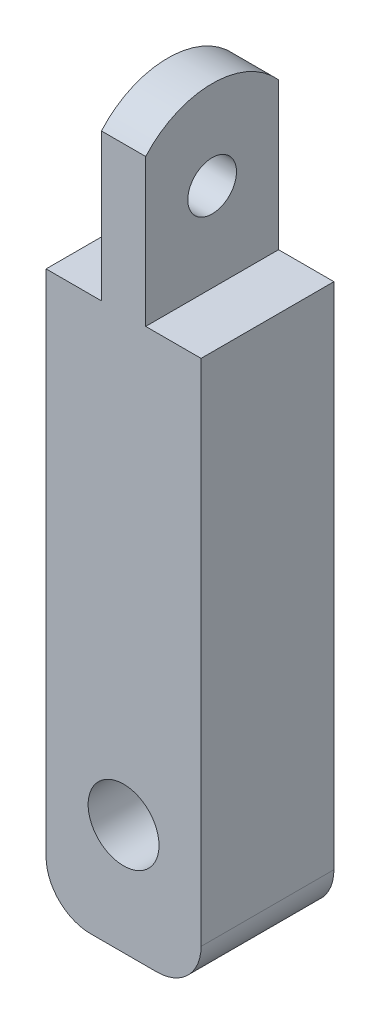
ISO-10303-21;
HEADER;
FILE_DESCRIPTION(('STEP AP214'),'2;1');
FILE_NAME('part.step','',(''),(''),'','','');
FILE_SCHEMA(('AUTOMOTIVE_DESIGN { 1 0 10303 214 1 1 1 1 }'));
ENDSEC;
DATA;
#1=APPLICATION_CONTEXT('core data for automotive mechanical design processes');
#2=APPLICATION_PROTOCOL_DEFINITION('international standard','automotive_design',2000,#1);
#3=PRODUCT_CONTEXT('',#1,'mechanical');
#4=PRODUCT('Part','Part','',(#3));
#5=PRODUCT_RELATED_PRODUCT_CATEGORY('part','',(#4));
#6=PRODUCT_DEFINITION_FORMATION('','',#4);
#7=PRODUCT_DEFINITION_CONTEXT('part definition',#1,'design');
#8=PRODUCT_DEFINITION('design','',#6,#7);
#9=PRODUCT_DEFINITION_SHAPE('','',#8);
#10=(LENGTH_UNIT() NAMED_UNIT(*) SI_UNIT(.MILLI.,.METRE.));
#11=(NAMED_UNIT(*) PLANE_ANGLE_UNIT() SI_UNIT($,.RADIAN.));
#12=(NAMED_UNIT(*) SI_UNIT($,.STERADIAN.) SOLID_ANGLE_UNIT());
#13=UNCERTAINTY_MEASURE_WITH_UNIT(LENGTH_MEASURE(1.E-05),#10,'distance_accuracy_value','');
#14=(GEOMETRIC_REPRESENTATION_CONTEXT(3) GLOBAL_UNCERTAINTY_ASSIGNED_CONTEXT((#13)) GLOBAL_UNIT_ASSIGNED_CONTEXT((#10,
#11,#12)) REPRESENTATION_CONTEXT('',''));
#15=CARTESIAN_POINT('',(0.,0.,0.));
#16=DIRECTION('',(0.,0.,1.));
#17=DIRECTION('',(1.,0.,0.));
#18=AXIS2_PLACEMENT_3D('',#15,#16,#17);
#19=CARTESIAN_POINT('',(1.,20.5,6.));
#20=DIRECTION('',(-1.,0.,0.));
#21=DIRECTION('',(0.,-1.,0.));
#22=AXIS2_PLACEMENT_3D('',#19,#20,#21);
#23=PLANE('',#22);
#24=CARTESIAN_POINT('',(1.,16.5,3.));
#25=DIRECTION('',(-1.,0.,0.));
#26=DIRECTION('',(0.,-1.,0.));
#27=AXIS2_PLACEMENT_3D('',#24,#25,#26);
#28=CIRCLE('',#27,1.1);
#29=CARTESIAN_POINT('',(1.,15.4,3.));
#30=VERTEX_POINT('',#29);
#31=EDGE_CURVE('E265',#30,#30,#28,.T.);
#32=ORIENTED_EDGE('',*,*,#31,.T.);
#33=EDGE_LOOP('',(#32));
#34=FACE_BOUND('',#33,.T.);
#35=DIRECTION('',(0.,1.,0.));
#36=VECTOR('',#35,1.);
#37=CARTESIAN_POINT('',(1.,20.5,0.));
#38=LINE('',#37,#36);
#39=CARTESIAN_POINT('',(1.,12.5,0.));
#40=VERTEX_POINT('',#39);
#41=CARTESIAN_POINT('',(1.,19.1457513110646,0.));
#42=VERTEX_POINT('',#41);
#43=EDGE_CURVE('E172',#40,#42,#38,.T.);
#44=ORIENTED_EDGE('',*,*,#43,.T.);
#45=CARTESIAN_POINT('',(1.,16.5,3.));
#46=DIRECTION('',(-1.,0.,0.));
#47=DIRECTION('',(0.,-1.,0.));
#48=AXIS2_PLACEMENT_3D('',#45,#46,#47);
#49=CIRCLE('',#48,4.);
#50=CARTESIAN_POINT('',(1.,19.1457513110646,6.));
#51=VERTEX_POINT('',#50);
#52=EDGE_CURVE('E156',#42,#51,#49,.F.);
#53=ORIENTED_EDGE('',*,*,#52,.T.);
#54=DIRECTION('',(0.,1.,0.));
#55=VECTOR('',#54,1.);
#56=CARTESIAN_POINT('',(1.,20.5,6.));
#57=LINE('',#56,#55);
#58=CARTESIAN_POINT('',(1.,12.5,6.));
#59=VERTEX_POINT('',#58);
#60=EDGE_CURVE('E245',#59,#51,#57,.T.);
#61=ORIENTED_EDGE('',*,*,#60,.F.);
#62=DIRECTION('',(0.,0.,-1.));
#63=VECTOR('',#62,1.);
#64=CARTESIAN_POINT('',(1.,12.5,6.));
#65=LINE('',#64,#63);
#66=EDGE_CURVE('E195',#59,#40,#65,.T.);
#67=ORIENTED_EDGE('',*,*,#66,.T.);
#68=EDGE_LOOP('',(#44,#53,#61,#67));
#69=FACE_BOUND('',#68,.T.);
#70=ADVANCED_FACE('F32',(#34,#69),#23,.F.);
#71=CARTESIAN_POINT('',(-1.,12.5,6.));
#72=DIRECTION('',(1.,0.,0.));
#73=DIRECTION('',(0.,1.,0.));
#74=AXIS2_PLACEMENT_3D('',#71,#72,#73);
#75=PLANE('',#74);
#76=CARTESIAN_POINT('',(-1.,16.5,3.));
#77=DIRECTION('',(-1.,0.,0.));
#78=DIRECTION('',(0.,-1.,0.));
#79=AXIS2_PLACEMENT_3D('',#76,#77,#78);
#80=CIRCLE('',#79,1.1);
#81=CARTESIAN_POINT('',(-1.,15.4,3.));
#82=VERTEX_POINT('',#81);
#83=EDGE_CURVE('E262',#82,#82,#80,.T.);
#84=ORIENTED_EDGE('',*,*,#83,.F.);
#85=EDGE_LOOP('',(#84));
#86=FACE_BOUND('',#85,.T.);
#87=CARTESIAN_POINT('',(-1.,16.5,3.));
#88=DIRECTION('',(-1.,0.,0.));
#89=DIRECTION('',(0.,0.,1.));
#90=AXIS2_PLACEMENT_3D('',#87,#88,#89);
#91=CIRCLE('',#90,4.);
#92=CARTESIAN_POINT('',(-1.,19.1457513110646,0.));
#93=VERTEX_POINT('',#92);
#94=CARTESIAN_POINT('',(-1.,19.1457513110646,6.));
#95=VERTEX_POINT('',#94);
#96=EDGE_CURVE('E146',#93,#95,#91,.F.);
#97=ORIENTED_EDGE('',*,*,#96,.F.);
#98=DIRECTION('',(0.,-1.,0.));
#99=VECTOR('',#98,1.);
#100=CARTESIAN_POINT('',(-1.,12.5,0.));
#101=LINE('',#100,#99);
#102=CARTESIAN_POINT('',(-1.,12.5,0.));
#103=VERTEX_POINT('',#102);
#104=EDGE_CURVE('E151',#93,#103,#101,.T.);
#105=ORIENTED_EDGE('',*,*,#104,.T.);
#106=DIRECTION('',(0.,0.,-1.));
#107=VECTOR('',#106,1.);
#108=CARTESIAN_POINT('',(-1.,12.5,6.));
#109=LINE('',#108,#107);
#110=CARTESIAN_POINT('',(-1.,12.5,6.));
#111=VERTEX_POINT('',#110);
#112=EDGE_CURVE('E193',#111,#103,#109,.T.);
#113=ORIENTED_EDGE('',*,*,#112,.F.);
#114=DIRECTION('',(0.,-1.,0.));
#115=VECTOR('',#114,1.);
#116=CARTESIAN_POINT('',(-1.,12.5,6.));
#117=LINE('',#116,#115);
#118=EDGE_CURVE('E153',#95,#111,#117,.T.);
#119=ORIENTED_EDGE('',*,*,#118,.F.);
#120=EDGE_LOOP('',(#97,#105,#113,#119));
#121=FACE_BOUND('',#120,.T.);
#122=ADVANCED_FACE('F148',(#86,#121),#75,.F.);
#123=CARTESIAN_POINT('',(0.,-7.5,0.));
#124=DIRECTION('',(0.,0.,1.));
#125=DIRECTION('',(1.,0.,0.));
#126=AXIS2_PLACEMENT_3D('',#123,#124,#125);
#127=CYLINDRICAL_SURFACE('',#126,1.6);
#128=CARTESIAN_POINT('',(0.,-7.5,6.));
#129=DIRECTION('',(0.,0.,1.));
#130=DIRECTION('',(1.,0.,0.));
#131=AXIS2_PLACEMENT_3D('',#128,#129,#130);
#132=CIRCLE('',#131,1.6);
#133=CARTESIAN_POINT('',(1.6,-7.5,6.));
#134=VERTEX_POINT('',#133);
#135=EDGE_CURVE('E201',#134,#134,#132,.T.);
#136=ORIENTED_EDGE('',*,*,#135,.T.);
#137=EDGE_LOOP('',(#136));
#138=FACE_BOUND('',#137,.T.);
#139=CARTESIAN_POINT('',(0.,-7.5,2.5));
#140=DIRECTION('',(0.,0.,-1.));
#141=DIRECTION('',(-1.,0.,0.));
#142=AXIS2_PLACEMENT_3D('',#139,#140,#141);
#143=CIRCLE('',#142,1.6);
#144=CARTESIAN_POINT('',(-1.6,-7.5,2.5));
#145=VERTEX_POINT('',#144);
#146=EDGE_CURVE('E198',#145,#145,#143,.F.);
#147=ORIENTED_EDGE('',*,*,#146,.F.);
#148=EDGE_LOOP('',(#147));
#149=FACE_BOUND('',#148,.T.);
#150=ADVANCED_FACE('F355',(#138,#149),#127,.F.);
#151=CARTESIAN_POINT('',(1.,12.5,6.));
#152=DIRECTION('',(0.,-1.,0.));
#153=DIRECTION('',(0.,0.,-1.));
#154=AXIS2_PLACEMENT_3D('',#151,#152,#153);
#155=PLANE('',#154);
#156=DIRECTION('',(-1.,0.,0.));
#157=VECTOR('',#156,1.);
#158=CARTESIAN_POINT('',(1.,12.5,0.));
#159=LINE('',#158,#157);
#160=CARTESIAN_POINT('',(3.5,12.5,0.));
#161=VERTEX_POINT('',#160);
#162=EDGE_CURVE('E176',#161,#40,#159,.T.);
#163=ORIENTED_EDGE('',*,*,#162,.T.);
#164=ORIENTED_EDGE('',*,*,#66,.F.);
#165=DIRECTION('',(-1.,0.,0.));
#166=VECTOR('',#165,1.);
#167=CARTESIAN_POINT('',(1.,12.5,6.));
#168=LINE('',#167,#166);
#169=CARTESIAN_POINT('',(3.5,12.5,6.));
#170=VERTEX_POINT('',#169);
#171=EDGE_CURVE('E185',#170,#59,#168,.T.);
#172=ORIENTED_EDGE('',*,*,#171,.F.);
#173=DIRECTION('',(0.,0.,-1.));
#174=VECTOR('',#173,1.);
#175=CARTESIAN_POINT('',(3.5,12.5,6.));
#176=LINE('',#175,#174);
#177=EDGE_CURVE('E186',#170,#161,#176,.T.);
#178=ORIENTED_EDGE('',*,*,#177,.T.);
#179=EDGE_LOOP('',(#163,#164,#172,#178));
#180=FACE_BOUND('',#179,.T.);
#181=ADVANCED_FACE('F360',(#180),#155,.F.);
#182=CARTESIAN_POINT('',(-3.5,12.5,6.));
#183=DIRECTION('',(0.,-1.,0.));
#184=DIRECTION('',(0.,0.,-1.));
#185=AXIS2_PLACEMENT_3D('',#182,#183,#184);
#186=PLANE('',#185);
#187=DIRECTION('',(-1.,0.,0.));
#188=VECTOR('',#187,1.);
#189=CARTESIAN_POINT('',(-3.5,12.5,0.));
#190=LINE('',#189,#188);
#191=CARTESIAN_POINT('',(-3.5,12.5,0.));
#192=VERTEX_POINT('',#191);
#193=EDGE_CURVE('E171',#103,#192,#190,.T.);
#194=ORIENTED_EDGE('',*,*,#193,.T.);
#195=DIRECTION('',(0.,0.,-1.));
#196=VECTOR('',#195,1.);
#197=CARTESIAN_POINT('',(-3.5,12.5,6.));
#198=LINE('',#197,#196);
#199=CARTESIAN_POINT('',(-3.5,12.5,6.));
#200=VERTEX_POINT('',#199);
#201=EDGE_CURVE('E189',#200,#192,#198,.T.);
#202=ORIENTED_EDGE('',*,*,#201,.F.);
#203=DIRECTION('',(-1.,0.,0.));
#204=VECTOR('',#203,1.);
#205=CARTESIAN_POINT('',(-3.5,12.5,6.));
#206=LINE('',#205,#204);
#207=EDGE_CURVE('E242',#111,#200,#206,.T.);
#208=ORIENTED_EDGE('',*,*,#207,.F.);
#209=ORIENTED_EDGE('',*,*,#112,.T.);
#210=EDGE_LOOP('',(#194,#202,#208,#209));
#211=FACE_BOUND('',#210,.T.);
#212=ADVANCED_FACE('F241',(#211),#186,.F.);
#213=CARTESIAN_POINT('',(-3.5,-12.5,6.));
#214=DIRECTION('',(1.,0.,0.));
#215=DIRECTION('',(0.,0.,-1.));
#216=AXIS2_PLACEMENT_3D('',#213,#214,#215);
#217=PLANE('',#216);
#218=DIRECTION('',(0.,-1.,0.));
#219=VECTOR('',#218,1.);
#220=CARTESIAN_POINT('',(-3.5,-12.5,0.));
#221=LINE('',#220,#219);
#222=CARTESIAN_POINT('',(-3.5,-10.5,0.));
#223=VERTEX_POINT('',#222);
#224=EDGE_CURVE('E174',#192,#223,#221,.T.);
#225=ORIENTED_EDGE('',*,*,#224,.T.);
#226=DIRECTION('',(0.,0.,-1.));
#227=VECTOR('',#226,1.);
#228=CARTESIAN_POINT('',(-3.5,-10.5,6.));
#229=LINE('',#228,#227);
#230=CARTESIAN_POINT('',(-3.5,-10.5,6.));
#231=VERTEX_POINT('',#230);
#232=EDGE_CURVE('E11',#223,#231,#229,.F.);
#233=ORIENTED_EDGE('',*,*,#232,.T.);
#234=DIRECTION('',(0.,-1.,0.));
#235=VECTOR('',#234,1.);
#236=CARTESIAN_POINT('',(-3.5,-12.5,6.));
#237=LINE('',#236,#235);
#238=EDGE_CURVE('E238',#200,#231,#237,.T.);
#239=ORIENTED_EDGE('',*,*,#238,.F.);
#240=ORIENTED_EDGE('',*,*,#201,.T.);
#241=EDGE_LOOP('',(#225,#233,#239,#240));
#242=FACE_BOUND('',#241,.T.);
#243=ADVANCED_FACE('F236',(#242),#217,.F.);
#244=CARTESIAN_POINT('',(-3.5,-12.5,6.));
#245=DIRECTION('',(0.,1.,0.));
#246=DIRECTION('',(0.,0.,1.));
#247=AXIS2_PLACEMENT_3D('',#244,#245,#246);
#248=PLANE('',#247);
#249=DIRECTION('',(1.,0.,0.));
#250=VECTOR('',#249,1.);
#251=CARTESIAN_POINT('',(-3.5,-12.5,0.));
#252=LINE('',#251,#250);
#253=CARTESIAN_POINT('',(-1.5,-12.5,0.));
#254=VERTEX_POINT('',#253);
#255=CARTESIAN_POINT('',(1.5,-12.5,0.));
#256=VERTEX_POINT('',#255);
#257=EDGE_CURVE('E181',#254,#256,#252,.T.);
#258=ORIENTED_EDGE('',*,*,#257,.T.);
#259=DIRECTION('',(0.,0.,-1.));
#260=VECTOR('',#259,1.);
#261=CARTESIAN_POINT('',(1.5,-12.5,6.));
#262=LINE('',#261,#260);
#263=CARTESIAN_POINT('',(1.5,-12.5,6.));
#264=VERTEX_POINT('',#263);
#265=EDGE_CURVE('E53',#256,#264,#262,.F.);
#266=ORIENTED_EDGE('',*,*,#265,.T.);
#267=DIRECTION('',(1.,0.,0.));
#268=VECTOR('',#267,1.);
#269=CARTESIAN_POINT('',(-3.5,-12.5,6.));
#270=LINE('',#269,#268);
#271=CARTESIAN_POINT('',(-1.5,-12.5,6.));
#272=VERTEX_POINT('',#271);
#273=EDGE_CURVE('E222',#272,#264,#270,.T.);
#274=ORIENTED_EDGE('',*,*,#273,.F.);
#275=DIRECTION('',(0.,0.,-1.));
#276=VECTOR('',#275,1.);
#277=CARTESIAN_POINT('',(-1.5,-12.5,6.));
#278=LINE('',#277,#276);
#279=EDGE_CURVE('E210',#272,#254,#278,.T.);
#280=ORIENTED_EDGE('',*,*,#279,.T.);
#281=EDGE_LOOP('',(#258,#266,#274,#280));
#282=FACE_BOUND('',#281,.T.);
#283=ADVANCED_FACE('F232',(#282),#248,.F.);
#284=CARTESIAN_POINT('',(3.5,-12.5,6.));
#285=DIRECTION('',(-1.,0.,0.));
#286=DIRECTION('',(0.,0.,1.));
#287=AXIS2_PLACEMENT_3D('',#284,#285,#286);
#288=PLANE('',#287);
#289=DIRECTION('',(0.,1.,0.));
#290=VECTOR('',#289,1.);
#291=CARTESIAN_POINT('',(3.5,-12.5,6.));
#292=LINE('',#291,#290);
#293=CARTESIAN_POINT('',(3.5,-10.5,6.));
#294=VERTEX_POINT('',#293);
#295=EDGE_CURVE('E190',#294,#170,#292,.T.);
#296=ORIENTED_EDGE('',*,*,#295,.F.);
#297=DIRECTION('',(0.,0.,-1.));
#298=VECTOR('',#297,1.);
#299=CARTESIAN_POINT('',(3.5,-10.5,6.));
#300=LINE('',#299,#298);
#301=CARTESIAN_POINT('',(3.5,-10.5,0.));
#302=VERTEX_POINT('',#301);
#303=EDGE_CURVE('E164',#294,#302,#300,.T.);
#304=ORIENTED_EDGE('',*,*,#303,.T.);
#305=DIRECTION('',(0.,1.,0.));
#306=VECTOR('',#305,1.);
#307=CARTESIAN_POINT('',(3.5,-12.5,0.));
#308=LINE('',#307,#306);
#309=EDGE_CURVE('E183',#302,#161,#308,.T.);
#310=ORIENTED_EDGE('',*,*,#309,.T.);
#311=ORIENTED_EDGE('',*,*,#177,.F.);
#312=EDGE_LOOP('',(#296,#304,#310,#311));
#313=FACE_BOUND('',#312,.T.);
#314=ADVANCED_FACE('F226',(#313),#288,.F.);
#315=CARTESIAN_POINT('',(0.,0.,6.));
#316=DIRECTION('',(0.,0.,1.));
#317=DIRECTION('',(1.,0.,0.));
#318=AXIS2_PLACEMENT_3D('',#315,#316,#317);
#319=PLANE('',#318);
#320=ORIENTED_EDGE('',*,*,#273,.T.);
#321=CARTESIAN_POINT('',(1.5,-10.5,6.));
#322=DIRECTION('',(0.,0.,1.));
#323=DIRECTION('',(1.,0.,0.));
#324=AXIS2_PLACEMENT_3D('',#321,#322,#323);
#325=CIRCLE('',#324,2.);
#326=EDGE_CURVE('E40',#264,#294,#325,.T.);
#327=ORIENTED_EDGE('',*,*,#326,.T.);
#328=ORIENTED_EDGE('',*,*,#295,.T.);
#329=ORIENTED_EDGE('',*,*,#171,.T.);
#330=ORIENTED_EDGE('',*,*,#60,.T.);
#331=DIRECTION('',(-1.,0.,0.));
#332=VECTOR('',#331,1.);
#333=CARTESIAN_POINT('',(3.5,19.1457513110646,6.));
#334=LINE('',#333,#332);
#335=EDGE_CURVE('E165',#95,#51,#334,.F.);
#336=ORIENTED_EDGE('',*,*,#335,.F.);
#337=ORIENTED_EDGE('',*,*,#118,.T.);
#338=ORIENTED_EDGE('',*,*,#207,.T.);
#339=ORIENTED_EDGE('',*,*,#238,.T.);
#340=CARTESIAN_POINT('',(-1.5,-10.5,6.));
#341=DIRECTION('',(0.,0.,1.));
#342=DIRECTION('',(1.,0.,0.));
#343=AXIS2_PLACEMENT_3D('',#340,#341,#342);
#344=CIRCLE('',#343,2.);
#345=EDGE_CURVE('E214',#231,#272,#344,.T.);
#346=ORIENTED_EDGE('',*,*,#345,.T.);
#347=EDGE_LOOP('',(#320,#327,#328,#329,#330,#336,#337,#338,#339,#346));
#348=FACE_BOUND('',#347,.T.);
#349=ORIENTED_EDGE('',*,*,#135,.F.);
#350=EDGE_LOOP('',(#349));
#351=FACE_BOUND('',#350,.T.);
#352=ADVANCED_FACE('F218',(#348,#351),#319,.T.);
#353=CARTESIAN_POINT('',(0.,0.,0.));
#354=DIRECTION('',(0.,0.,1.));
#355=DIRECTION('',(1.,0.,0.));
#356=AXIS2_PLACEMENT_3D('',#353,#354,#355);
#357=PLANE('',#356);
#358=DIRECTION('',(0.866025403784439,-0.5,0.));
#359=VECTOR('',#358,1.);
#360=CARTESIAN_POINT('',(0.,-4.29570600599758,0.));
#361=LINE('',#360,#359);
#362=CARTESIAN_POINT('',(0.,-4.29570600599758,0.));
#363=VERTEX_POINT('',#362);
#364=CARTESIAN_POINT('',(2.775,-5.89785300299879,0.));
#365=VERTEX_POINT('',#364);
#366=EDGE_CURVE('E291',#363,#365,#361,.T.);
#367=ORIENTED_EDGE('',*,*,#366,.F.);
#368=DIRECTION('',(0.866025403784439,0.5,0.));
#369=VECTOR('',#368,1.);
#370=CARTESIAN_POINT('',(-2.775,-5.89785300299879,0.));
#371=LINE('',#370,#369);
#372=CARTESIAN_POINT('',(-2.775,-5.89785300299879,0.));
#373=VERTEX_POINT('',#372);
#374=EDGE_CURVE('E270',#373,#363,#371,.T.);
#375=ORIENTED_EDGE('',*,*,#374,.F.);
#376=DIRECTION('',(0.,1.,0.));
#377=VECTOR('',#376,1.);
#378=CARTESIAN_POINT('',(-2.775,-9.10214699700122,0.));
#379=LINE('',#378,#377);
#380=CARTESIAN_POINT('',(-2.775,-9.10214699700122,0.));
#381=VERTEX_POINT('',#380);
#382=EDGE_CURVE('E275',#381,#373,#379,.T.);
#383=ORIENTED_EDGE('',*,*,#382,.F.);
#384=DIRECTION('',(-0.866025403784439,0.5,0.));
#385=VECTOR('',#384,1.);
#386=CARTESIAN_POINT('',(0.,-10.7042939940024,0.));
#387=LINE('',#386,#385);
#388=CARTESIAN_POINT('',(0.,-10.7042939940024,0.));
#389=VERTEX_POINT('',#388);
#390=EDGE_CURVE('E300',#389,#381,#387,.T.);
#391=ORIENTED_EDGE('',*,*,#390,.F.);
#392=DIRECTION('',(-0.866025403784439,-0.5,0.));
#393=VECTOR('',#392,1.);
#394=CARTESIAN_POINT('',(2.775,-9.10214699700122,0.));
#395=LINE('',#394,#393);
#396=CARTESIAN_POINT('',(2.775,-9.10214699700122,0.));
#397=VERTEX_POINT('',#396);
#398=EDGE_CURVE('E297',#397,#389,#395,.T.);
#399=ORIENTED_EDGE('',*,*,#398,.F.);
#400=DIRECTION('',(0.,-1.,0.));
#401=VECTOR('',#400,1.);
#402=CARTESIAN_POINT('',(2.775,-5.89785300299879,0.));
#403=LINE('',#402,#401);
#404=EDGE_CURVE('E294',#365,#397,#403,.T.);
#405=ORIENTED_EDGE('',*,*,#404,.F.);
#406=EDGE_LOOP('',(#367,#375,#383,#391,#399,#405));
#407=FACE_BOUND('',#406,.T.);
#408=ORIENTED_EDGE('',*,*,#309,.F.);
#409=CARTESIAN_POINT('',(1.5,-10.5,0.));
#410=DIRECTION('',(0.,0.,1.));
#411=DIRECTION('',(1.,0.,0.));
#412=AXIS2_PLACEMENT_3D('',#409,#410,#411);
#413=CIRCLE('',#412,2.);
#414=EDGE_CURVE('E208',#302,#256,#413,.F.);
#415=ORIENTED_EDGE('',*,*,#414,.T.);
#416=ORIENTED_EDGE('',*,*,#257,.F.);
#417=CARTESIAN_POINT('',(-1.5,-10.5,0.));
#418=DIRECTION('',(0.,0.,1.));
#419=DIRECTION('',(1.,0.,0.));
#420=AXIS2_PLACEMENT_3D('',#417,#418,#419);
#421=CIRCLE('',#420,2.);
#422=EDGE_CURVE('E206',#254,#223,#421,.F.);
#423=ORIENTED_EDGE('',*,*,#422,.T.);
#424=ORIENTED_EDGE('',*,*,#224,.F.);
#425=ORIENTED_EDGE('',*,*,#193,.F.);
#426=ORIENTED_EDGE('',*,*,#104,.F.);
#427=DIRECTION('',(-1.,0.,0.));
#428=VECTOR('',#427,1.);
#429=CARTESIAN_POINT('',(3.5,19.1457513110646,0.));
#430=LINE('',#429,#428);
#431=EDGE_CURVE('E159',#93,#42,#430,.F.);
#432=ORIENTED_EDGE('',*,*,#431,.T.);
#433=ORIENTED_EDGE('',*,*,#43,.F.);
#434=ORIENTED_EDGE('',*,*,#162,.F.);
#435=EDGE_LOOP('',(#408,#415,#416,#423,#424,#425,#426,#432,#433,#434));
#436=FACE_BOUND('',#435,.T.);
#437=ADVANCED_FACE('F169',(#407,#436),#357,.F.);
#438=CARTESIAN_POINT('',(0.,0.,2.5));
#439=DIRECTION('',(0.,0.,-1.));
#440=DIRECTION('',(-1.,0.,0.));
#441=AXIS2_PLACEMENT_3D('',#438,#439,#440);
#442=PLANE('',#441);
#443=DIRECTION('',(0.866025403784439,0.5,0.));
#444=VECTOR('',#443,1.);
#445=CARTESIAN_POINT('',(-2.775,-5.89785300299879,2.5));
#446=LINE('',#445,#444);
#447=CARTESIAN_POINT('',(-2.775,-5.89785300299879,2.5));
#448=VERTEX_POINT('',#447);
#449=CARTESIAN_POINT('',(0.,-4.29570600599758,2.5));
#450=VERTEX_POINT('',#449);
#451=EDGE_CURVE('E271',#448,#450,#446,.T.);
#452=ORIENTED_EDGE('',*,*,#451,.T.);
#453=DIRECTION('',(0.866025403784439,-0.5,0.));
#454=VECTOR('',#453,1.);
#455=CARTESIAN_POINT('',(0.,-4.29570600599758,2.5));
#456=LINE('',#455,#454);
#457=CARTESIAN_POINT('',(2.775,-5.89785300299879,2.5));
#458=VERTEX_POINT('',#457);
#459=EDGE_CURVE('E274',#450,#458,#456,.T.);
#460=ORIENTED_EDGE('',*,*,#459,.T.);
#461=DIRECTION('',(0.,-1.,0.));
#462=VECTOR('',#461,1.);
#463=CARTESIAN_POINT('',(2.775,-5.89785300299879,2.5));
#464=LINE('',#463,#462);
#465=CARTESIAN_POINT('',(2.775,-9.10214699700122,2.5));
#466=VERTEX_POINT('',#465);
#467=EDGE_CURVE('E278',#458,#466,#464,.T.);
#468=ORIENTED_EDGE('',*,*,#467,.T.);
#469=DIRECTION('',(-0.866025403784439,-0.5,0.));
#470=VECTOR('',#469,1.);
#471=CARTESIAN_POINT('',(2.775,-9.10214699700122,2.5));
#472=LINE('',#471,#470);
#473=CARTESIAN_POINT('',(0.,-10.7042939940024,2.5));
#474=VERTEX_POINT('',#473);
#475=EDGE_CURVE('E281',#466,#474,#472,.T.);
#476=ORIENTED_EDGE('',*,*,#475,.T.);
#477=DIRECTION('',(-0.866025403784439,0.5,0.));
#478=VECTOR('',#477,1.);
#479=CARTESIAN_POINT('',(0.,-10.7042939940024,2.5));
#480=LINE('',#479,#478);
#481=CARTESIAN_POINT('',(-2.775,-9.10214699700122,2.5));
#482=VERTEX_POINT('',#481);
#483=EDGE_CURVE('E284',#474,#482,#480,.T.);
#484=ORIENTED_EDGE('',*,*,#483,.T.);
#485=DIRECTION('',(0.,1.,0.));
#486=VECTOR('',#485,1.);
#487=CARTESIAN_POINT('',(-2.775,-9.10214699700122,2.5));
#488=LINE('',#487,#486);
#489=EDGE_CURVE('E287',#482,#448,#488,.T.);
#490=ORIENTED_EDGE('',*,*,#489,.T.);
#491=EDGE_LOOP('',(#452,#460,#468,#476,#484,#490));
#492=FACE_BOUND('',#491,.T.);
#493=ORIENTED_EDGE('',*,*,#146,.T.);
#494=EDGE_LOOP('',(#493));
#495=FACE_BOUND('',#494,.T.);
#496=ADVANCED_FACE('F333',(#492,#495),#442,.T.);
#497=CARTESIAN_POINT('',(-2.775,-5.89785300299879,2.5));
#498=DIRECTION('',(-0.5,0.866025403784438,0.));
#499=DIRECTION('',(-0.866025403784439,-0.5,0.));
#500=AXIS2_PLACEMENT_3D('',#497,#498,#499);
#501=PLANE('',#500);
#502=ORIENTED_EDGE('',*,*,#374,.T.);
#503=DIRECTION('',(0.,0.,-1.));
#504=VECTOR('',#503,1.);
#505=CARTESIAN_POINT('',(0.,-4.29570600599758,2.5));
#506=LINE('',#505,#504);
#507=EDGE_CURVE('E258',#450,#363,#506,.T.);
#508=ORIENTED_EDGE('',*,*,#507,.F.);
#509=ORIENTED_EDGE('',*,*,#451,.F.);
#510=DIRECTION('',(0.,0.,-1.));
#511=VECTOR('',#510,1.);
#512=CARTESIAN_POINT('',(-2.775,-5.89785300299879,2.5));
#513=LINE('',#512,#511);
#514=EDGE_CURVE('E202',#448,#373,#513,.T.);
#515=ORIENTED_EDGE('',*,*,#514,.T.);
#516=EDGE_LOOP('',(#502,#508,#509,#515));
#517=FACE_BOUND('',#516,.T.);
#518=ADVANCED_FACE('F336',(#517),#501,.F.);
#519=CARTESIAN_POINT('',(-2.775,-9.10214699700122,2.5));
#520=DIRECTION('',(-1.,0.,0.));
#521=DIRECTION('',(0.,-1.,0.));
#522=AXIS2_PLACEMENT_3D('',#519,#520,#521);
#523=PLANE('',#522);
#524=ORIENTED_EDGE('',*,*,#382,.T.);
#525=ORIENTED_EDGE('',*,*,#514,.F.);
#526=ORIENTED_EDGE('',*,*,#489,.F.);
#527=DIRECTION('',(0.,0.,-1.));
#528=VECTOR('',#527,1.);
#529=CARTESIAN_POINT('',(-2.775,-9.10214699700122,2.5));
#530=LINE('',#529,#528);
#531=EDGE_CURVE('E306',#482,#381,#530,.T.);
#532=ORIENTED_EDGE('',*,*,#531,.T.);
#533=EDGE_LOOP('',(#524,#525,#526,#532));
#534=FACE_BOUND('',#533,.T.);
#535=ADVANCED_FACE('F338',(#534),#523,.F.);
#536=CARTESIAN_POINT('',(0.,-10.7042939940024,2.5));
#537=DIRECTION('',(-0.5,-0.866025403784439,0.));
#538=DIRECTION('',(0.866025403784439,-0.5,0.));
#539=AXIS2_PLACEMENT_3D('',#536,#537,#538);
#540=PLANE('',#539);
#541=ORIENTED_EDGE('',*,*,#390,.T.);
#542=ORIENTED_EDGE('',*,*,#531,.F.);
#543=ORIENTED_EDGE('',*,*,#483,.F.);
#544=DIRECTION('',(0.,0.,-1.));
#545=VECTOR('',#544,1.);
#546=CARTESIAN_POINT('',(0.,-10.7042939940024,2.5));
#547=LINE('',#546,#545);
#548=EDGE_CURVE('E308',#474,#389,#547,.T.);
#549=ORIENTED_EDGE('',*,*,#548,.T.);
#550=EDGE_LOOP('',(#541,#542,#543,#549));
#551=FACE_BOUND('',#550,.T.);
#552=ADVANCED_FACE('F340',(#551),#540,.F.);
#553=CARTESIAN_POINT('',(2.775,-9.10214699700122,2.5));
#554=DIRECTION('',(0.5,-0.866025403784438,0.));
#555=DIRECTION('',(0.866025403784438,0.5,0.));
#556=AXIS2_PLACEMENT_3D('',#553,#554,#555);
#557=PLANE('',#556);
#558=ORIENTED_EDGE('',*,*,#398,.T.);
#559=ORIENTED_EDGE('',*,*,#548,.F.);
#560=ORIENTED_EDGE('',*,*,#475,.F.);
#561=DIRECTION('',(0.,0.,-1.));
#562=VECTOR('',#561,1.);
#563=CARTESIAN_POINT('',(2.775,-9.10214699700122,2.5));
#564=LINE('',#563,#562);
#565=EDGE_CURVE('E310',#466,#397,#564,.T.);
#566=ORIENTED_EDGE('',*,*,#565,.T.);
#567=EDGE_LOOP('',(#558,#559,#560,#566));
#568=FACE_BOUND('',#567,.T.);
#569=ADVANCED_FACE('F330',(#568),#557,.F.);
#570=CARTESIAN_POINT('',(2.775,-5.89785300299879,2.5));
#571=DIRECTION('',(1.,0.,0.));
#572=DIRECTION('',(0.,1.,0.));
#573=AXIS2_PLACEMENT_3D('',#570,#571,#572);
#574=PLANE('',#573);
#575=ORIENTED_EDGE('',*,*,#404,.T.);
#576=ORIENTED_EDGE('',*,*,#565,.F.);
#577=ORIENTED_EDGE('',*,*,#467,.F.);
#578=DIRECTION('',(0.,0.,-1.));
#579=VECTOR('',#578,1.);
#580=CARTESIAN_POINT('',(2.775,-5.89785300299879,2.5));
#581=LINE('',#580,#579);
#582=EDGE_CURVE('E311',#458,#365,#581,.T.);
#583=ORIENTED_EDGE('',*,*,#582,.T.);
#584=EDGE_LOOP('',(#575,#576,#577,#583));
#585=FACE_BOUND('',#584,.T.);
#586=ADVANCED_FACE('F327',(#585),#574,.F.);
#587=CARTESIAN_POINT('',(0.,-4.29570600599758,2.5));
#588=DIRECTION('',(0.5,0.866025403784439,0.));
#589=DIRECTION('',(-0.866025403784439,0.5,0.));
#590=AXIS2_PLACEMENT_3D('',#587,#588,#589);
#591=PLANE('',#590);
#592=ORIENTED_EDGE('',*,*,#366,.T.);
#593=ORIENTED_EDGE('',*,*,#582,.F.);
#594=ORIENTED_EDGE('',*,*,#459,.F.);
#595=ORIENTED_EDGE('',*,*,#507,.T.);
#596=EDGE_LOOP('',(#592,#593,#594,#595));
#597=FACE_BOUND('',#596,.T.);
#598=ADVANCED_FACE('F318',(#597),#591,.F.);
#599=CARTESIAN_POINT('',(3.5,16.5,3.));
#600=DIRECTION('',(-1.,0.,0.));
#601=DIRECTION('',(0.,-1.,0.));
#602=AXIS2_PLACEMENT_3D('',#599,#600,#601);
#603=CYLINDRICAL_SURFACE('',#602,1.1);
#604=ORIENTED_EDGE('',*,*,#83,.T.);
#605=EDGE_LOOP('',(#604));
#606=FACE_BOUND('',#605,.T.);
#607=ORIENTED_EDGE('',*,*,#31,.F.);
#608=EDGE_LOOP('',(#607));
#609=FACE_BOUND('',#608,.T.);
#610=ADVANCED_FACE('F367',(#606,#609),#603,.F.);
#611=CARTESIAN_POINT('',(3.5,16.5,3.));
#612=DIRECTION('',(-1.,0.,0.));
#613=DIRECTION('',(0.,0.,1.));
#614=AXIS2_PLACEMENT_3D('',#611,#612,#613);
#615=CYLINDRICAL_SURFACE('',#614,4.);
#616=ORIENTED_EDGE('',*,*,#52,.F.);
#617=ORIENTED_EDGE('',*,*,#431,.F.);
#618=ORIENTED_EDGE('',*,*,#96,.T.);
#619=ORIENTED_EDGE('',*,*,#335,.T.);
#620=EDGE_LOOP('',(#616,#617,#618,#619));
#621=FACE_BOUND('',#620,.T.);
#622=ADVANCED_FACE('F160',(#621),#615,.T.);
#623=CARTESIAN_POINT('',(1.5,-10.5,6.));
#624=DIRECTION('',(0.,0.,-1.));
#625=DIRECTION('',(-1.,0.,0.));
#626=AXIS2_PLACEMENT_3D('',#623,#624,#625);
#627=CYLINDRICAL_SURFACE('',#626,2.);
#628=ORIENTED_EDGE('',*,*,#326,.F.);
#629=ORIENTED_EDGE('',*,*,#265,.F.);
#630=ORIENTED_EDGE('',*,*,#414,.F.);
#631=ORIENTED_EDGE('',*,*,#303,.F.);
#632=EDGE_LOOP('',(#628,#629,#630,#631));
#633=FACE_BOUND('',#632,.T.);
#634=ADVANCED_FACE('F229',(#633),#627,.T.);
#635=CARTESIAN_POINT('',(-1.5,-10.5,6.));
#636=DIRECTION('',(0.,0.,-1.));
#637=DIRECTION('',(-1.,0.,0.));
#638=AXIS2_PLACEMENT_3D('',#635,#636,#637);
#639=CYLINDRICAL_SURFACE('',#638,2.);
#640=ORIENTED_EDGE('',*,*,#345,.F.);
#641=ORIENTED_EDGE('',*,*,#232,.F.);
#642=ORIENTED_EDGE('',*,*,#422,.F.);
#643=ORIENTED_EDGE('',*,*,#279,.F.);
#644=EDGE_LOOP('',(#640,#641,#642,#643));
#645=FACE_BOUND('',#644,.T.);
#646=ADVANCED_FACE('F34',(#645),#639,.T.);
#647=CLOSED_SHELL('',(#70,#122,#150,#181,#212,#243,#283,#314,#352,#437,#496,#518,#535,#552,#569,
#586,#598,#610,#622,#634,#646));
#648=MANIFOLD_SOLID_BREP('B2',#647);
#649=ADVANCED_BREP_SHAPE_REPRESENTATION('',(#18,#648),#14);
#650=SHAPE_DEFINITION_REPRESENTATION(#9,#649);
ENDSEC;
END-ISO-10303-21;
